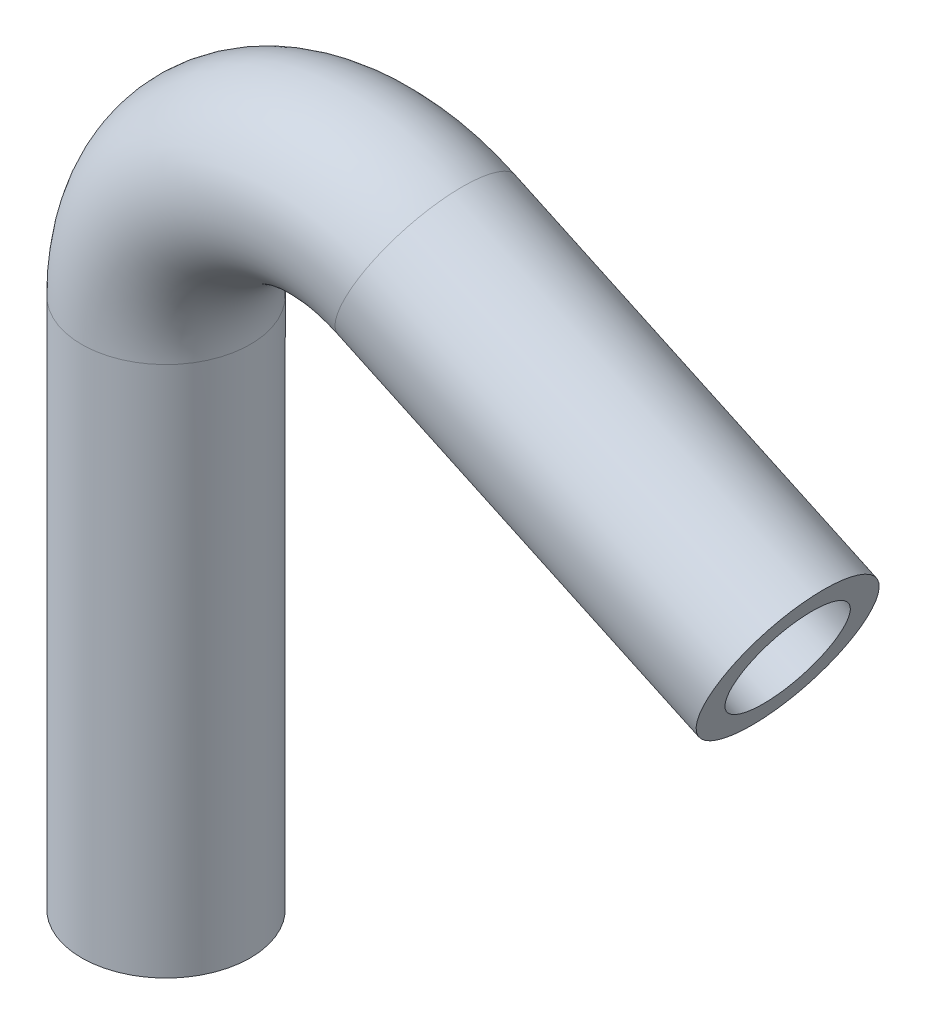
ISO-10303-21;
HEADER;
FILE_DESCRIPTION(('STEP AP214'),'2;1');
FILE_NAME('part.step','',(''),(''),'','','');
FILE_SCHEMA(('AUTOMOTIVE_DESIGN { 1 0 10303 214 1 1 1 1 }'));
ENDSEC;
DATA;
#1=APPLICATION_CONTEXT('core data for automotive mechanical design processes');
#2=APPLICATION_PROTOCOL_DEFINITION('international standard','automotive_design',2000,#1);
#3=PRODUCT_CONTEXT('',#1,'mechanical');
#4=PRODUCT('Part','Part','',(#3));
#5=PRODUCT_RELATED_PRODUCT_CATEGORY('part','',(#4));
#6=PRODUCT_DEFINITION_FORMATION('','',#4);
#7=PRODUCT_DEFINITION_CONTEXT('part definition',#1,'design');
#8=PRODUCT_DEFINITION('design','',#6,#7);
#9=PRODUCT_DEFINITION_SHAPE('','',#8);
#10=(LENGTH_UNIT() NAMED_UNIT(*) SI_UNIT(.MILLI.,.METRE.));
#11=(NAMED_UNIT(*) PLANE_ANGLE_UNIT() SI_UNIT($,.RADIAN.));
#12=(NAMED_UNIT(*) SI_UNIT($,.STERADIAN.) SOLID_ANGLE_UNIT());
#13=UNCERTAINTY_MEASURE_WITH_UNIT(LENGTH_MEASURE(1.E-05),#10,'distance_accuracy_value','');
#14=(GEOMETRIC_REPRESENTATION_CONTEXT(3) GLOBAL_UNCERTAINTY_ASSIGNED_CONTEXT((#13)) GLOBAL_UNIT_ASSIGNED_CONTEXT((#10,
#11,#12)) REPRESENTATION_CONTEXT('',''));
#15=CARTESIAN_POINT('',(0.,0.,0.));
#16=DIRECTION('',(0.,0.,1.));
#17=DIRECTION('',(1.,0.,0.));
#18=AXIS2_PLACEMENT_3D('',#15,#16,#17);
#19=CARTESIAN_POINT('',(0.,0.,0.));
#20=DIRECTION('',(0.,-1.,0.));
#21=DIRECTION('',(1.,0.,0.));
#22=AXIS2_PLACEMENT_3D('',#19,#20,#21);
#23=PLANE('',#22);
#24=CARTESIAN_POINT('',(0.,0.,0.));
#25=DIRECTION('',(0.,-1.,0.));
#26=DIRECTION('',(1.,0.,0.));
#27=AXIS2_PLACEMENT_3D('',#24,#25,#26);
#28=CIRCLE('',#27,2.175);
#29=CARTESIAN_POINT('',(2.175,0.,0.));
#30=VERTEX_POINT('',#29);
#31=EDGE_CURVE('E70',#30,#30,#28,.T.);
#32=ORIENTED_EDGE('',*,*,#31,.F.);
#33=EDGE_LOOP('',(#32));
#34=FACE_BOUND('',#33,.T.);
#35=CARTESIAN_POINT('',(0.,0.,0.));
#36=DIRECTION('',(0.,-1.,0.));
#37=DIRECTION('',(1.,0.,0.));
#38=AXIS2_PLACEMENT_3D('',#35,#36,#37);
#39=CIRCLE('',#38,3.175);
#40=CARTESIAN_POINT('',(3.175,0.,0.));
#41=VERTEX_POINT('',#40);
#42=EDGE_CURVE('E61',#41,#41,#39,.T.);
#43=ORIENTED_EDGE('',*,*,#42,.T.);
#44=EDGE_LOOP('',(#43));
#45=FACE_BOUND('',#44,.T.);
#46=ADVANCED_FACE('F47',(#34,#45),#23,.T.);
#47=CARTESIAN_POINT('',(23.4011553859463,19.9081801649214,0.));
#48=DIRECTION('',(-0.906307787036648,0.422618261740704,0.));
#49=DIRECTION('',(-0.422618261740704,-0.906307787036648,0.));
#50=AXIS2_PLACEMENT_3D('',#47,#48,#49);
#51=PLANE('',#50);
#52=CARTESIAN_POINT('',(23.4011553859463,19.9081801649214,0.));
#53=DIRECTION('',(-0.906307787036648,0.422618261740704,0.));
#54=DIRECTION('',(-0.422618261740704,-0.906307787036648,0.));
#55=AXIS2_PLACEMENT_3D('',#52,#53,#54);
#56=CIRCLE('',#55,2.175);
#57=CARTESIAN_POINT('',(22.4819606666603,17.9369607281167,0.));
#58=VERTEX_POINT('',#57);
#59=EDGE_CURVE('E66',#58,#58,#56,.T.);
#60=ORIENTED_EDGE('',*,*,#59,.T.);
#61=EDGE_LOOP('',(#60));
#62=FACE_BOUND('',#61,.T.);
#63=CARTESIAN_POINT('',(23.4011553859463,19.9081801649214,0.));
#64=DIRECTION('',(-0.906307787036648,0.422618261740704,0.));
#65=DIRECTION('',(-0.422618261740704,-0.906307787036648,0.));
#66=AXIS2_PLACEMENT_3D('',#63,#64,#65);
#67=CIRCLE('',#66,3.175);
#68=CARTESIAN_POINT('',(22.0593424049196,17.03065294108,0.));
#69=VERTEX_POINT('',#68);
#70=EDGE_CURVE('E11',#69,#69,#67,.T.);
#71=ORIENTED_EDGE('',*,*,#70,.F.);
#72=EDGE_LOOP('',(#71));
#73=FACE_BOUND('',#72,.T.);
#74=ADVANCED_FACE('F90',(#62,#73),#51,.F.);
#75=CARTESIAN_POINT('',(0.,0.,0.));
#76=DIRECTION('',(0.,1.,0.));
#77=DIRECTION('',(0.,0.,1.));
#78=AXIS2_PLACEMENT_3D('',#75,#76,#77);
#79=CYLINDRICAL_SURFACE('',#78,3.175);
#80=CARTESIAN_POINT('',(0.,20.,0.));
#81=DIRECTION('',(0.,-1.,0.));
#82=DIRECTION('',(1.,0.,0.));
#83=AXIS2_PLACEMENT_3D('',#80,#81,#82);
#84=CIRCLE('',#83,3.175);
#85=CARTESIAN_POINT('',(-3.17500000000001,20.,0.));
#86=VERTEX_POINT('',#85);
#87=EDGE_CURVE('E57',#86,#86,#84,.T.);
#88=ORIENTED_EDGE('',*,*,#87,.T.);
#89=EDGE_LOOP('',(#88));
#90=FACE_BOUND('',#89,.T.);
#91=ORIENTED_EDGE('',*,*,#42,.F.);
#92=EDGE_LOOP('',(#91));
#93=FACE_BOUND('',#92,.T.);
#94=ADVANCED_FACE('F94',(#90,#93),#79,.T.);
#95=CARTESIAN_POINT('',(6.89330289377656,20.,0.));
#96=DIRECTION('',(0.,0.,-1.));
#97=DIRECTION('',(-1.,0.,0.));
#98=AXIS2_PLACEMENT_3D('',#95,#96,#97);
#99=TOROIDAL_SURFACE('',#98,6.89330289377657,3.175);
#100=CARTESIAN_POINT('',(9.80653858039659,26.247454091032,0.));
#101=DIRECTION('',(-0.906307787036648,0.422618261740704,0.));
#102=DIRECTION('',(-0.422618261740704,-0.906307787036648,0.));
#103=AXIS2_PLACEMENT_3D('',#100,#101,#102);
#104=CIRCLE('',#103,3.175);
#105=CARTESIAN_POINT('',(11.1483515614233,29.1249813148733,0.));
#106=VERTEX_POINT('',#105);
#107=EDGE_CURVE('E53',#106,#106,#104,.T.);
#108=CARTESIAN_POINT('',(6.89330289377656,20.,0.));
#109=DIRECTION('',(0.,0.,-1.));
#110=DIRECTION('',(-1.,0.,0.));
#111=AXIS2_PLACEMENT_3D('',#108,#109,#110);
#112=CIRCLE('',#111,10.0683028937766);
#113=EDGE_CURVE('',#86,#106,#112,.T.);
#114=ORIENTED_EDGE('',*,*,#87,.F.);
#115=ORIENTED_EDGE('',*,*,#107,.T.);
#116=ORIENTED_EDGE('',*,*,#113,.T.);
#117=ORIENTED_EDGE('',*,*,#113,.F.);
#118=EDGE_LOOP('',(#114,#116,#115,#117));
#119=FACE_BOUND('',#118,.T.);
#120=ADVANCED_FACE('F96',(#119),#99,.T.);
#121=CARTESIAN_POINT('',(9.80653858039659,26.247454091032,0.));
#122=DIRECTION('',(0.906307787036648,-0.422618261740704,0.));
#123=DIRECTION('',(0.422618261740704,0.906307787036648,0.));
#124=AXIS2_PLACEMENT_3D('',#121,#122,#123);
#125=CYLINDRICAL_SURFACE('',#124,3.175);
#126=ORIENTED_EDGE('',*,*,#70,.T.);
#127=EDGE_LOOP('',(#126));
#128=FACE_BOUND('',#127,.T.);
#129=ORIENTED_EDGE('',*,*,#107,.F.);
#130=EDGE_LOOP('',(#129));
#131=FACE_BOUND('',#130,.T.);
#132=ADVANCED_FACE('F84',(#128,#131),#125,.T.);
#133=CARTESIAN_POINT('',(0.,0.,0.));
#134=DIRECTION('',(0.,1.,0.));
#135=DIRECTION('',(0.,0.,1.));
#136=AXIS2_PLACEMENT_3D('',#133,#134,#135);
#137=CYLINDRICAL_SURFACE('',#136,2.175);
#138=CARTESIAN_POINT('',(0.,20.,0.));
#139=DIRECTION('',(0.,1.,0.));
#140=DIRECTION('',(0.,0.,1.));
#141=AXIS2_PLACEMENT_3D('',#138,#139,#140);
#142=CIRCLE('',#141,2.175);
#143=CARTESIAN_POINT('',(-2.17500000000001,20.,0.));
#144=VERTEX_POINT('',#143);
#145=EDGE_CURVE('E73',#144,#144,#142,.F.);
#146=ORIENTED_EDGE('',*,*,#145,.F.);
#147=EDGE_LOOP('',(#146));
#148=FACE_BOUND('',#147,.T.);
#149=ORIENTED_EDGE('',*,*,#31,.T.);
#150=EDGE_LOOP('',(#149));
#151=FACE_BOUND('',#150,.T.);
#152=ADVANCED_FACE('F81',(#148,#151),#137,.F.);
#153=CARTESIAN_POINT('',(6.89330289377656,20.,0.));
#154=DIRECTION('',(0.,0.,-1.));
#155=DIRECTION('',(-1.,0.,0.));
#156=AXIS2_PLACEMENT_3D('',#153,#154,#155);
#157=TOROIDAL_SURFACE('',#156,6.89330289377657,2.175);
#158=CARTESIAN_POINT('',(9.80653858039659,26.247454091032,0.));
#159=DIRECTION('',(-0.906307787036647,0.422618261740705,0.));
#160=DIRECTION('',(-0.422618261740705,-0.906307787036647,0.));
#161=AXIS2_PLACEMENT_3D('',#158,#159,#160);
#162=CIRCLE('',#161,2.175);
#163=CARTESIAN_POINT('',(10.7257332996826,28.2186735278367,0.));
#164=VERTEX_POINT('',#163);
#165=EDGE_CURVE('E69',#164,#164,#162,.T.);
#166=CARTESIAN_POINT('',(6.89330289377656,20.,0.));
#167=DIRECTION('',(0.,0.,-1.));
#168=DIRECTION('',(-1.,0.,0.));
#169=AXIS2_PLACEMENT_3D('',#166,#167,#168);
#170=CIRCLE('',#169,9.06830289377657);
#171=EDGE_CURVE('',#144,#164,#170,.T.);
#172=ORIENTED_EDGE('',*,*,#145,.T.);
#173=ORIENTED_EDGE('',*,*,#165,.F.);
#174=ORIENTED_EDGE('',*,*,#171,.T.);
#175=ORIENTED_EDGE('',*,*,#171,.F.);
#176=EDGE_LOOP('',(#172,#174,#173,#175));
#177=FACE_BOUND('',#176,.T.);
#178=ADVANCED_FACE('F79',(#177),#157,.F.);
#179=CARTESIAN_POINT('',(9.80653858039659,26.247454091032,0.));
#180=DIRECTION('',(0.906307787036648,-0.422618261740704,0.));
#181=DIRECTION('',(0.422618261740704,0.906307787036648,0.));
#182=AXIS2_PLACEMENT_3D('',#179,#180,#181);
#183=CYLINDRICAL_SURFACE('',#182,2.175);
#184=ORIENTED_EDGE('',*,*,#59,.F.);
#185=EDGE_LOOP('',(#184));
#186=FACE_BOUND('',#185,.T.);
#187=ORIENTED_EDGE('',*,*,#165,.T.);
#188=EDGE_LOOP('',(#187));
#189=FACE_BOUND('',#188,.T.);
#190=ADVANCED_FACE('F91',(#186,#189),#183,.F.);
#191=CLOSED_SHELL('',(#46,#74,#94,#120,#132,#152,#178,#190));
#192=MANIFOLD_SOLID_BREP('B2',#191);
#193=ADVANCED_BREP_SHAPE_REPRESENTATION('',(#18,#192),#14);
#194=SHAPE_DEFINITION_REPRESENTATION(#9,#193);
ENDSEC;
END-ISO-10303-21;
